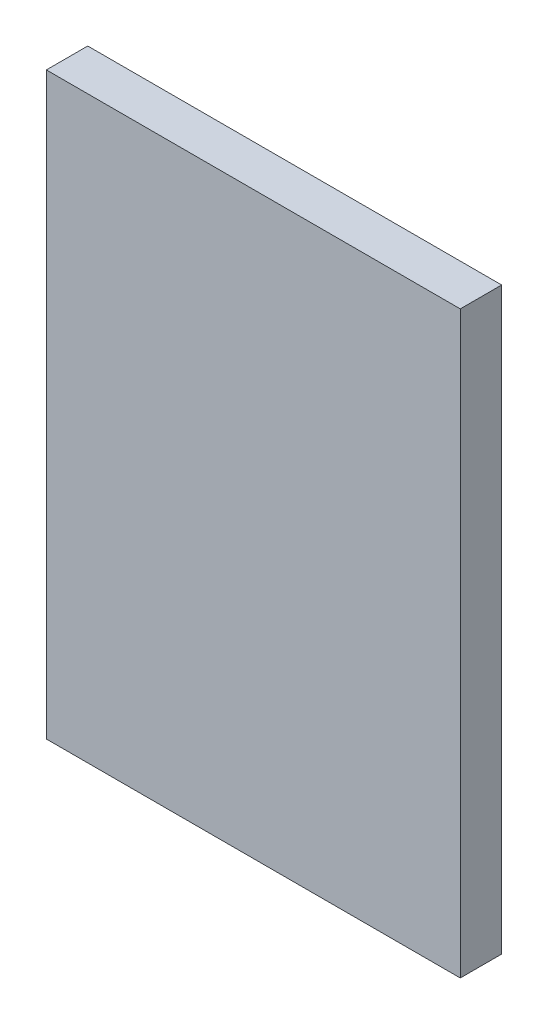
ISO-10303-21;
HEADER;
FILE_DESCRIPTION(('STEP AP214'),'2;1');
FILE_NAME('part.step','',(''),(''),'','','');
FILE_SCHEMA(('AUTOMOTIVE_DESIGN { 1 0 10303 214 1 1 1 1 }'));
ENDSEC;
DATA;
#1=APPLICATION_CONTEXT('core data for automotive mechanical design processes');
#2=APPLICATION_PROTOCOL_DEFINITION('international standard','automotive_design',2000,#1);
#3=PRODUCT_CONTEXT('',#1,'mechanical');
#4=PRODUCT('Part','Part','',(#3));
#5=PRODUCT_RELATED_PRODUCT_CATEGORY('part','',(#4));
#6=PRODUCT_DEFINITION_FORMATION('','',#4);
#7=PRODUCT_DEFINITION_CONTEXT('part definition',#1,'design');
#8=PRODUCT_DEFINITION('design','',#6,#7);
#9=PRODUCT_DEFINITION_SHAPE('','',#8);
#10=(LENGTH_UNIT() NAMED_UNIT(*) SI_UNIT(.MILLI.,.METRE.));
#11=(NAMED_UNIT(*) PLANE_ANGLE_UNIT() SI_UNIT($,.RADIAN.));
#12=(NAMED_UNIT(*) SI_UNIT($,.STERADIAN.) SOLID_ANGLE_UNIT());
#13=UNCERTAINTY_MEASURE_WITH_UNIT(LENGTH_MEASURE(1.E-05),#10,'distance_accuracy_value','');
#14=(GEOMETRIC_REPRESENTATION_CONTEXT(3) GLOBAL_UNCERTAINTY_ASSIGNED_CONTEXT((#13)) GLOBAL_UNIT_ASSIGNED_CONTEXT((#10,
#11,#12)) REPRESENTATION_CONTEXT('',''));
#15=CARTESIAN_POINT('',(0.,0.,0.));
#16=DIRECTION('',(0.,0.,1.));
#17=DIRECTION('',(1.,0.,0.));
#18=AXIS2_PLACEMENT_3D('',#15,#16,#17);
#19=CARTESIAN_POINT('',(43.799774867975,34.700905827566,0.5));
#20=DIRECTION('',(0.,0.,1.));
#21=DIRECTION('',(1.,0.,0.));
#22=AXIS2_PLACEMENT_3D('',#19,#20,#21);
#23=PLANE('',#22);
#24=DIRECTION('',(1.,1.19248806385E-08,0.));
#25=VECTOR('',#24,1.);
#26=CARTESIAN_POINT('',(43.799774867975,34.700905827566,0.5));
#27=LINE('',#26,#25);
#28=CARTESIAN_POINT('',(43.799774867975,34.700905827566,0.5));
#29=VERTEX_POINT('',#28);
#30=CARTESIAN_POINT('',(44.299774867975,34.700905833528,0.5));
#31=VERTEX_POINT('',#30);
#32=EDGE_CURVE('E63',#29,#31,#27,.T.);
#33=ORIENTED_EDGE('',*,*,#32,.F.);
#34=DIRECTION('',(1.19248806385E-08,-1.,0.));
#35=VECTOR('',#34,1.);
#36=CARTESIAN_POINT('',(43.799774867975,34.700905827566,0.5));
#37=LINE('',#36,#35);
#38=CARTESIAN_POINT('',(43.799774876322,34.000905827566,0.5));
#39=VERTEX_POINT('',#38);
#40=EDGE_CURVE('E88',#29,#39,#37,.T.);
#41=ORIENTED_EDGE('',*,*,#40,.T.);
#42=DIRECTION('',(1.,1.19248806385E-08,0.));
#43=VECTOR('',#42,1.);
#44=CARTESIAN_POINT('',(43.799774876322,34.000905827566,0.5));
#45=LINE('',#44,#43);
#46=CARTESIAN_POINT('',(44.299774876322,34.000905833528,0.5));
#47=VERTEX_POINT('',#46);
#48=EDGE_CURVE('E65',#39,#47,#45,.T.);
#49=ORIENTED_EDGE('',*,*,#48,.T.);
#50=DIRECTION('',(1.19248806385E-08,-1.,0.));
#51=VECTOR('',#50,1.);
#52=CARTESIAN_POINT('',(44.299774867975,34.700905833528,0.5));
#53=LINE('',#52,#51);
#54=EDGE_CURVE('E11',#31,#47,#53,.T.);
#55=ORIENTED_EDGE('',*,*,#54,.F.);
#56=EDGE_LOOP('',(#33,#41,#49,#55));
#57=FACE_BOUND('',#56,.T.);
#58=ADVANCED_FACE('F16',(#57),#23,.T.);
#59=CARTESIAN_POINT('',(43.799774867975,34.700905827566,0.45));
#60=DIRECTION('',(0.,0.,1.));
#61=DIRECTION('',(1.,0.,0.));
#62=AXIS2_PLACEMENT_3D('',#59,#60,#61);
#63=PLANE('',#62);
#64=DIRECTION('',(1.19248806385E-08,-1.,0.));
#65=VECTOR('',#64,1.);
#66=CARTESIAN_POINT('',(44.299774867975,34.700905833528,0.45));
#67=LINE('',#66,#65);
#68=CARTESIAN_POINT('',(44.299774867975,34.700905833528,0.45));
#69=VERTEX_POINT('',#68);
#70=CARTESIAN_POINT('',(44.299774876322,34.000905833528,0.45));
#71=VERTEX_POINT('',#70);
#72=EDGE_CURVE('E27',#69,#71,#67,.T.);
#73=ORIENTED_EDGE('',*,*,#72,.T.);
#74=DIRECTION('',(1.,1.19248806385E-08,0.));
#75=VECTOR('',#74,1.);
#76=CARTESIAN_POINT('',(43.799774876322,34.000905827566,0.45));
#77=LINE('',#76,#75);
#78=CARTESIAN_POINT('',(43.799774876322,34.000905827566,0.45));
#79=VERTEX_POINT('',#78);
#80=EDGE_CURVE('E100',#79,#71,#77,.T.);
#81=ORIENTED_EDGE('',*,*,#80,.F.);
#82=DIRECTION('',(1.19248806385E-08,-1.,0.));
#83=VECTOR('',#82,1.);
#84=CARTESIAN_POINT('',(43.799774867975,34.700905827566,0.45));
#85=LINE('',#84,#83);
#86=CARTESIAN_POINT('',(43.799774867975,34.700905827566,0.45));
#87=VERTEX_POINT('',#86);
#88=EDGE_CURVE('E91',#87,#79,#85,.T.);
#89=ORIENTED_EDGE('',*,*,#88,.F.);
#90=DIRECTION('',(1.,1.19248806385E-08,0.));
#91=VECTOR('',#90,1.);
#92=CARTESIAN_POINT('',(43.799774867975,34.700905827566,0.45));
#93=LINE('',#92,#91);
#94=EDGE_CURVE('E73',#87,#69,#93,.T.);
#95=ORIENTED_EDGE('',*,*,#94,.T.);
#96=EDGE_LOOP('',(#73,#81,#89,#95));
#97=FACE_BOUND('',#96,.T.);
#98=ADVANCED_FACE('F114',(#97),#63,.F.);
#99=CARTESIAN_POINT('',(44.299774867975,34.700905833528,0.45));
#100=DIRECTION('',(1.,1.19248806385E-08,0.));
#101=DIRECTION('',(0.,0.,-1.));
#102=AXIS2_PLACEMENT_3D('',#99,#100,#101);
#103=PLANE('',#102);
#104=ORIENTED_EDGE('',*,*,#72,.F.);
#105=DIRECTION('',(0.,0.,1.));
#106=VECTOR('',#105,1.);
#107=CARTESIAN_POINT('',(44.299774867975,34.700905833528,0.45));
#108=LINE('',#107,#106);
#109=EDGE_CURVE('E20',#69,#31,#108,.T.);
#110=ORIENTED_EDGE('',*,*,#109,.T.);
#111=ORIENTED_EDGE('',*,*,#54,.T.);
#112=DIRECTION('',(0.,0.,1.));
#113=VECTOR('',#112,1.);
#114=CARTESIAN_POINT('',(44.299774876322,34.000905833528,0.45));
#115=LINE('',#114,#113);
#116=EDGE_CURVE('E101',#71,#47,#115,.T.);
#117=ORIENTED_EDGE('',*,*,#116,.F.);
#118=EDGE_LOOP('',(#104,#110,#111,#117));
#119=FACE_BOUND('',#118,.T.);
#120=ADVANCED_FACE('F68',(#119),#103,.T.);
#121=CARTESIAN_POINT('',(43.799774867975,34.700905827566,0.45));
#122=DIRECTION('',(1.,1.19248806385E-08,0.));
#123=DIRECTION('',(0.,0.,-1.));
#124=AXIS2_PLACEMENT_3D('',#121,#122,#123);
#125=PLANE('',#124);
#126=DIRECTION('',(0.,0.,1.));
#127=VECTOR('',#126,1.);
#128=CARTESIAN_POINT('',(43.799774876322,34.000905827566,0.45));
#129=LINE('',#128,#127);
#130=EDGE_CURVE('E96',#79,#39,#129,.T.);
#131=ORIENTED_EDGE('',*,*,#130,.T.);
#132=ORIENTED_EDGE('',*,*,#40,.F.);
#133=DIRECTION('',(0.,0.,1.));
#134=VECTOR('',#133,1.);
#135=CARTESIAN_POINT('',(43.799774867975,34.700905827566,0.45));
#136=LINE('',#135,#134);
#137=EDGE_CURVE('E77',#87,#29,#136,.T.);
#138=ORIENTED_EDGE('',*,*,#137,.F.);
#139=ORIENTED_EDGE('',*,*,#88,.T.);
#140=EDGE_LOOP('',(#131,#132,#138,#139));
#141=FACE_BOUND('',#140,.T.);
#142=ADVANCED_FACE('F110',(#141),#125,.F.);
#143=CARTESIAN_POINT('',(43.799774876322,34.000905827566,0.45));
#144=DIRECTION('',(1.19248806385E-08,-1.,0.));
#145=DIRECTION('',(0.,0.,-1.));
#146=AXIS2_PLACEMENT_3D('',#143,#144,#145);
#147=PLANE('',#146);
#148=ORIENTED_EDGE('',*,*,#130,.F.);
#149=ORIENTED_EDGE('',*,*,#80,.T.);
#150=ORIENTED_EDGE('',*,*,#116,.T.);
#151=ORIENTED_EDGE('',*,*,#48,.F.);
#152=EDGE_LOOP('',(#148,#149,#150,#151));
#153=FACE_BOUND('',#152,.T.);
#154=ADVANCED_FACE('F18',(#153),#147,.T.);
#155=CARTESIAN_POINT('',(43.799774867975,34.700905827566,0.45));
#156=DIRECTION('',(1.19248806385E-08,-1.,0.));
#157=DIRECTION('',(0.,0.,-1.));
#158=AXIS2_PLACEMENT_3D('',#155,#156,#157);
#159=PLANE('',#158);
#160=ORIENTED_EDGE('',*,*,#32,.T.);
#161=ORIENTED_EDGE('',*,*,#109,.F.);
#162=ORIENTED_EDGE('',*,*,#94,.F.);
#163=ORIENTED_EDGE('',*,*,#137,.T.);
#164=EDGE_LOOP('',(#160,#161,#162,#163));
#165=FACE_BOUND('',#164,.T.);
#166=ADVANCED_FACE('F75',(#165),#159,.F.);
#167=CLOSED_SHELL('',(#58,#98,#120,#142,#154,#166));
#168=MANIFOLD_SOLID_BREP('B1',#167);
#169=ADVANCED_BREP_SHAPE_REPRESENTATION('',(#18,#168),#14);
#170=SHAPE_DEFINITION_REPRESENTATION(#9,#169);
ENDSEC;
END-ISO-10303-21;
